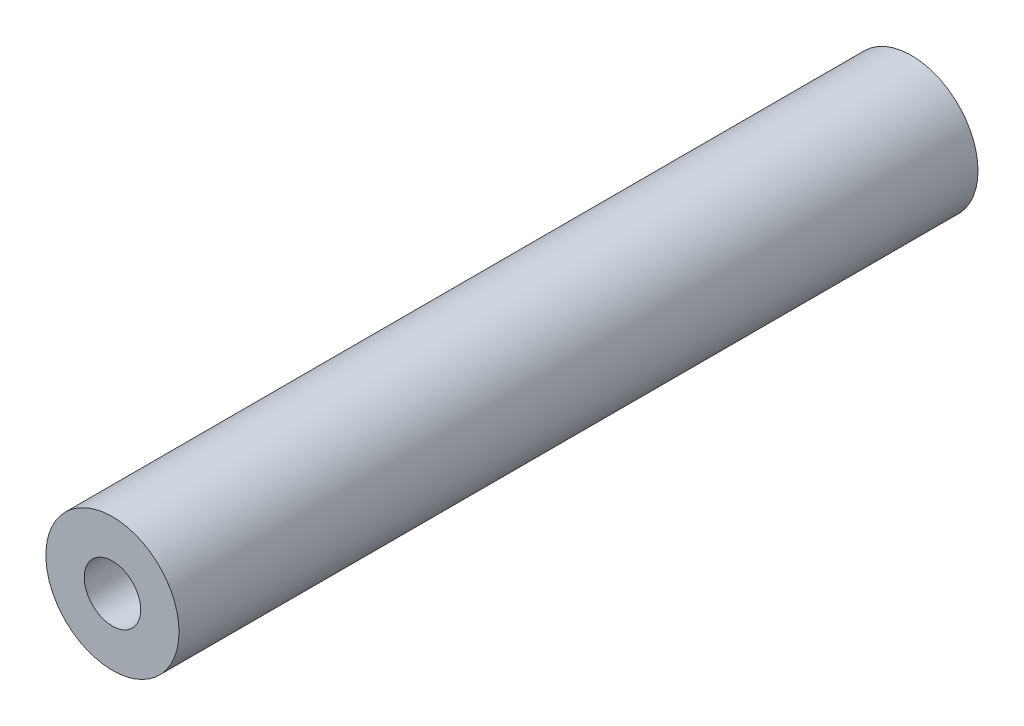
ISO-10303-21;
HEADER;
FILE_DESCRIPTION(('STEP AP214'),'2;1');
FILE_NAME('part.step','',(''),(''),'','','');
FILE_SCHEMA(('AUTOMOTIVE_DESIGN { 1 0 10303 214 1 1 1 1 }'));
ENDSEC;
DATA;
#1=APPLICATION_CONTEXT('core data for automotive mechanical design processes');
#2=APPLICATION_PROTOCOL_DEFINITION('international standard','automotive_design',2000,#1);
#3=PRODUCT_CONTEXT('',#1,'mechanical');
#4=PRODUCT('Part','Part','',(#3));
#5=PRODUCT_RELATED_PRODUCT_CATEGORY('part','',(#4));
#6=PRODUCT_DEFINITION_FORMATION('','',#4);
#7=PRODUCT_DEFINITION_CONTEXT('part definition',#1,'design');
#8=PRODUCT_DEFINITION('design','',#6,#7);
#9=PRODUCT_DEFINITION_SHAPE('','',#8);
#10=(LENGTH_UNIT() NAMED_UNIT(*) SI_UNIT(.MILLI.,.METRE.));
#11=(NAMED_UNIT(*) PLANE_ANGLE_UNIT() SI_UNIT($,.RADIAN.));
#12=(NAMED_UNIT(*) SI_UNIT($,.STERADIAN.) SOLID_ANGLE_UNIT());
#13=UNCERTAINTY_MEASURE_WITH_UNIT(LENGTH_MEASURE(1.E-05),#10,'distance_accuracy_value','');
#14=(GEOMETRIC_REPRESENTATION_CONTEXT(3) GLOBAL_UNCERTAINTY_ASSIGNED_CONTEXT((#13)) GLOBAL_UNIT_ASSIGNED_CONTEXT((#10,
#11,#12)) REPRESENTATION_CONTEXT('',''));
#15=CARTESIAN_POINT('',(0.,0.,0.));
#16=DIRECTION('',(0.,0.,1.));
#17=DIRECTION('',(1.,0.,0.));
#18=AXIS2_PLACEMENT_3D('',#15,#16,#17);
#19=CARTESIAN_POINT('',(0.,0.,57.15));
#20=DIRECTION('',(0.,0.,1.));
#21=DIRECTION('',(1.,0.,0.));
#22=AXIS2_PLACEMENT_3D('',#19,#20,#21);
#23=PLANE('',#22);
#24=CARTESIAN_POINT('',(0.,0.,57.15));
#25=DIRECTION('',(0.,0.,1.));
#26=DIRECTION('',(1.,0.,0.));
#27=AXIS2_PLACEMENT_3D('',#24,#25,#26);
#28=CIRCLE('',#27,4.7625);
#29=CARTESIAN_POINT('',(4.7625,0.,57.15));
#30=VERTEX_POINT('',#29);
#31=EDGE_CURVE('E10',#30,#30,#28,.T.);
#32=ORIENTED_EDGE('',*,*,#31,.T.);
#33=EDGE_LOOP('',(#32));
#34=FACE_BOUND('',#33,.T.);
#35=CARTESIAN_POINT('',(0.,0.,57.15));
#36=DIRECTION('',(0.,0.,1.));
#37=DIRECTION('',(1.,0.,0.));
#38=AXIS2_PLACEMENT_3D('',#35,#36,#37);
#39=CIRCLE('',#38,2.0193);
#40=CARTESIAN_POINT('',(2.0193,0.,57.15));
#41=VERTEX_POINT('',#40);
#42=EDGE_CURVE('E46',#41,#41,#39,.T.);
#43=ORIENTED_EDGE('',*,*,#42,.F.);
#44=EDGE_LOOP('',(#43));
#45=FACE_BOUND('',#44,.T.);
#46=ADVANCED_FACE('F35',(#34,#45),#23,.T.);
#47=CARTESIAN_POINT('',(0.,0.,0.));
#48=DIRECTION('',(0.,0.,1.));
#49=DIRECTION('',(1.,0.,0.));
#50=AXIS2_PLACEMENT_3D('',#47,#48,#49);
#51=PLANE('',#50);
#52=CARTESIAN_POINT('',(0.,0.,0.));
#53=DIRECTION('',(0.,0.,1.));
#54=DIRECTION('',(1.,0.,0.));
#55=AXIS2_PLACEMENT_3D('',#52,#53,#54);
#56=CIRCLE('',#55,4.7625);
#57=CARTESIAN_POINT('',(4.7625,0.,0.));
#58=VERTEX_POINT('',#57);
#59=EDGE_CURVE('E39',#58,#58,#56,.T.);
#60=ORIENTED_EDGE('',*,*,#59,.F.);
#61=EDGE_LOOP('',(#60));
#62=FACE_BOUND('',#61,.T.);
#63=CARTESIAN_POINT('',(0.,0.,0.));
#64=DIRECTION('',(0.,0.,1.));
#65=DIRECTION('',(1.,0.,0.));
#66=AXIS2_PLACEMENT_3D('',#63,#64,#65);
#67=CIRCLE('',#66,2.0193);
#68=CARTESIAN_POINT('',(2.0193,0.,0.));
#69=VERTEX_POINT('',#68);
#70=EDGE_CURVE('E48',#69,#69,#67,.T.);
#71=ORIENTED_EDGE('',*,*,#70,.T.);
#72=EDGE_LOOP('',(#71));
#73=FACE_BOUND('',#72,.T.);
#74=ADVANCED_FACE('F58',(#62,#73),#51,.F.);
#75=CARTESIAN_POINT('',(0.,0.,57.15));
#76=DIRECTION('',(0.,0.,-1.));
#77=DIRECTION('',(-1.,0.,0.));
#78=AXIS2_PLACEMENT_3D('',#75,#76,#77);
#79=CYLINDRICAL_SURFACE('',#78,4.7625);
#80=ORIENTED_EDGE('',*,*,#31,.F.);
#81=EDGE_LOOP('',(#80));
#82=FACE_BOUND('',#81,.T.);
#83=ORIENTED_EDGE('',*,*,#59,.T.);
#84=EDGE_LOOP('',(#83));
#85=FACE_BOUND('',#84,.T.);
#86=ADVANCED_FACE('F37',(#82,#85),#79,.T.);
#87=CARTESIAN_POINT('',(0.,0.,57.15));
#88=DIRECTION('',(0.,0.,-1.));
#89=DIRECTION('',(-1.,0.,0.));
#90=AXIS2_PLACEMENT_3D('',#87,#88,#89);
#91=CYLINDRICAL_SURFACE('',#90,2.0193);
#92=ORIENTED_EDGE('',*,*,#42,.T.);
#93=EDGE_LOOP('',(#92));
#94=FACE_BOUND('',#93,.T.);
#95=ORIENTED_EDGE('',*,*,#70,.F.);
#96=EDGE_LOOP('',(#95));
#97=FACE_BOUND('',#96,.T.);
#98=ADVANCED_FACE('F54',(#94,#97),#91,.F.);
#99=CLOSED_SHELL('',(#46,#74,#86,#98));
#100=MANIFOLD_SOLID_BREP('B2',#99);
#101=ADVANCED_BREP_SHAPE_REPRESENTATION('',(#18,#100),#14);
#102=SHAPE_DEFINITION_REPRESENTATION(#9,#101);
ENDSEC;
END-ISO-10303-21;
